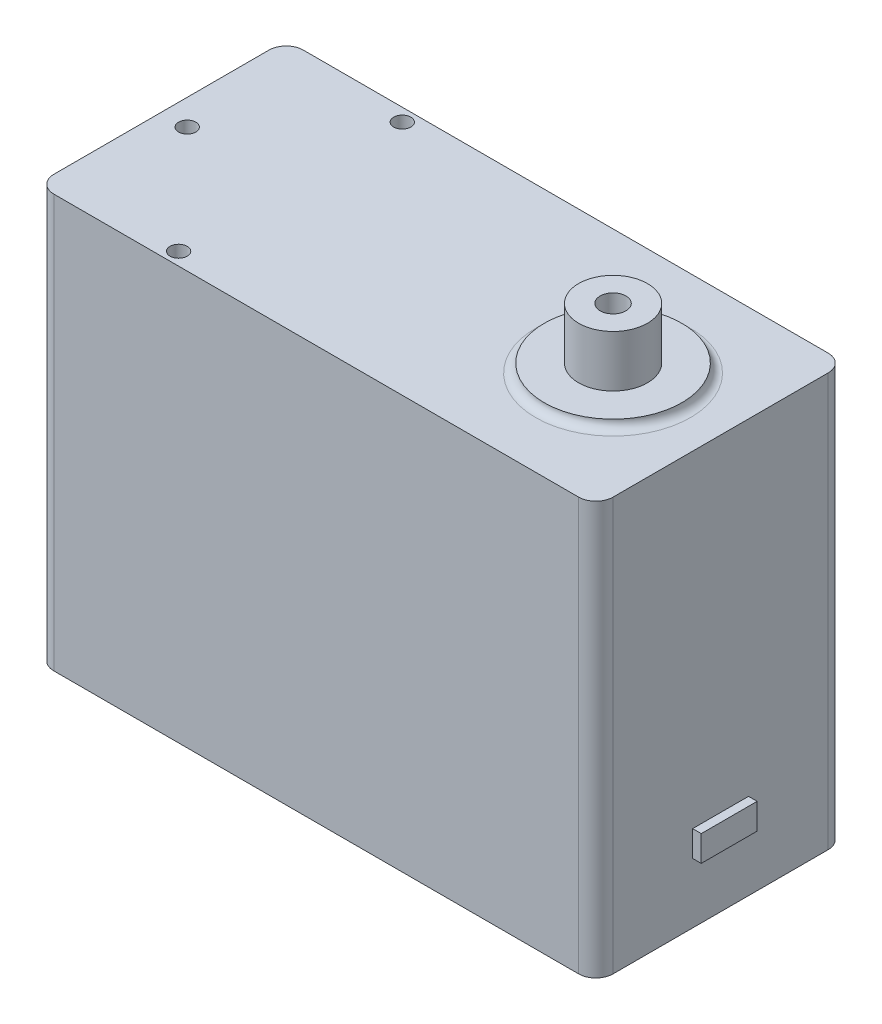
ISO-10303-21;
HEADER;
FILE_DESCRIPTION(('STEP AP214'),'2;1');
FILE_NAME('part.step','',(''),(''),'','','');
FILE_SCHEMA(('AUTOMOTIVE_DESIGN { 1 0 10303 214 1 1 1 1 }'));
ENDSEC;
DATA;
#1=APPLICATION_CONTEXT('core data for automotive mechanical design processes');
#2=APPLICATION_PROTOCOL_DEFINITION('international standard','automotive_design',2000,#1);
#3=PRODUCT_CONTEXT('',#1,'mechanical');
#4=PRODUCT('Part','Part','',(#3));
#5=PRODUCT_RELATED_PRODUCT_CATEGORY('part','',(#4));
#6=PRODUCT_DEFINITION_FORMATION('','',#4);
#7=PRODUCT_DEFINITION_CONTEXT('part definition',#1,'design');
#8=PRODUCT_DEFINITION('design','',#6,#7);
#9=PRODUCT_DEFINITION_SHAPE('','',#8);
#10=(LENGTH_UNIT() NAMED_UNIT(*) SI_UNIT(.MILLI.,.METRE.));
#11=(NAMED_UNIT(*) PLANE_ANGLE_UNIT() SI_UNIT($,.RADIAN.));
#12=(NAMED_UNIT(*) SI_UNIT($,.STERADIAN.) SOLID_ANGLE_UNIT());
#13=UNCERTAINTY_MEASURE_WITH_UNIT(LENGTH_MEASURE(1.E-05),#10,'distance_accuracy_value','');
#14=(GEOMETRIC_REPRESENTATION_CONTEXT(3) GLOBAL_UNCERTAINTY_ASSIGNED_CONTEXT((#13)) GLOBAL_UNIT_ASSIGNED_CONTEXT((#10,
#11,#12)) REPRESENTATION_CONTEXT('',''));
#15=CARTESIAN_POINT('',(0.,0.,0.));
#16=DIRECTION('',(0.,0.,1.));
#17=DIRECTION('',(1.,0.,0.));
#18=AXIS2_PLACEMENT_3D('',#15,#16,#17);
#19=CARTESIAN_POINT('',(32.5,24.,-14.5));
#20=DIRECTION('',(-1.,0.,0.));
#21=DIRECTION('',(0.,0.,1.));
#22=AXIS2_PLACEMENT_3D('',#19,#20,#21);
#23=PLANE('',#22);
#24=DIRECTION('',(0.,0.,-1.));
#25=VECTOR('',#24,1.);
#26=CARTESIAN_POINT('',(32.5,-24.,-14.5));
#27=LINE('',#26,#25);
#28=CARTESIAN_POINT('',(32.5,-24.,12.5));
#29=VERTEX_POINT('',#28);
#30=CARTESIAN_POINT('',(32.5,-24.,-12.5));
#31=VERTEX_POINT('',#30);
#32=EDGE_CURVE('E217',#29,#31,#27,.T.);
#33=ORIENTED_EDGE('',*,*,#32,.T.);
#34=DIRECTION('',(0.,-1.,0.));
#35=VECTOR('',#34,1.);
#36=CARTESIAN_POINT('',(32.5,24.,-12.5));
#37=LINE('',#36,#35);
#38=CARTESIAN_POINT('',(32.5,24.,-12.5));
#39=VERTEX_POINT('',#38);
#40=EDGE_CURVE('E271',#31,#39,#37,.F.);
#41=ORIENTED_EDGE('',*,*,#40,.T.);
#42=DIRECTION('',(0.,0.,-1.));
#43=VECTOR('',#42,1.);
#44=CARTESIAN_POINT('',(32.5,24.,-14.5));
#45=LINE('',#44,#43);
#46=CARTESIAN_POINT('',(32.5,24.,12.5));
#47=VERTEX_POINT('',#46);
#48=EDGE_CURVE('E232',#47,#39,#45,.T.);
#49=ORIENTED_EDGE('',*,*,#48,.F.);
#50=DIRECTION('',(0.,-1.,0.));
#51=VECTOR('',#50,1.);
#52=CARTESIAN_POINT('',(32.5,24.,12.5));
#53=LINE('',#52,#51);
#54=EDGE_CURVE('E268',#47,#29,#53,.T.);
#55=ORIENTED_EDGE('',*,*,#54,.T.);
#56=EDGE_LOOP('',(#33,#41,#49,#55));
#57=FACE_BOUND('',#56,.T.);
#58=DIRECTION('',(0.,1.,0.));
#59=VECTOR('',#58,1.);
#60=CARTESIAN_POINT('',(32.5,-14.,-3.25));
#61=LINE('',#60,#59);
#62=CARTESIAN_POINT('',(32.5,-17.,-3.25));
#63=VERTEX_POINT('',#62);
#64=CARTESIAN_POINT('',(32.5,-14.,-3.25));
#65=VERTEX_POINT('',#64);
#66=EDGE_CURVE('E144',#63,#65,#61,.T.);
#67=ORIENTED_EDGE('',*,*,#66,.F.);
#68=DIRECTION('',(0.,0.,-1.));
#69=VECTOR('',#68,1.);
#70=CARTESIAN_POINT('',(32.5,-17.,3.25));
#71=LINE('',#70,#69);
#72=CARTESIAN_POINT('',(32.5,-17.,3.25));
#73=VERTEX_POINT('',#72);
#74=EDGE_CURVE('E141',#73,#63,#71,.T.);
#75=ORIENTED_EDGE('',*,*,#74,.F.);
#76=DIRECTION('',(0.,-1.,0.));
#77=VECTOR('',#76,1.);
#78=CARTESIAN_POINT('',(32.5,-14.,3.25));
#79=LINE('',#78,#77);
#80=CARTESIAN_POINT('',(32.5,-14.,3.25));
#81=VERTEX_POINT('',#80);
#82=EDGE_CURVE('E55',#81,#73,#79,.T.);
#83=ORIENTED_EDGE('',*,*,#82,.F.);
#84=DIRECTION('',(0.,0.,1.));
#85=VECTOR('',#84,1.);
#86=CARTESIAN_POINT('',(32.5,-14.,3.25));
#87=LINE('',#86,#85);
#88=EDGE_CURVE('E50',#65,#81,#87,.T.);
#89=ORIENTED_EDGE('',*,*,#88,.F.);
#90=EDGE_LOOP('',(#67,#75,#83,#89));
#91=FACE_BOUND('',#90,.T.);
#92=ADVANCED_FACE('F34',(#57,#91),#23,.F.);
#93=CARTESIAN_POINT('',(-32.5,24.,-14.5));
#94=DIRECTION('',(0.,0.,1.));
#95=DIRECTION('',(1.,0.,0.));
#96=AXIS2_PLACEMENT_3D('',#93,#94,#95);
#97=PLANE('',#96);
#98=DIRECTION('',(-1.,0.,0.));
#99=VECTOR('',#98,1.);
#100=CARTESIAN_POINT('',(-32.5,24.,-14.5));
#101=LINE('',#100,#99);
#102=CARTESIAN_POINT('',(30.5,24.,-14.5));
#103=VERTEX_POINT('',#102);
#104=CARTESIAN_POINT('',(-30.5,24.,-14.5));
#105=VERTEX_POINT('',#104);
#106=EDGE_CURVE('E235',#103,#105,#101,.T.);
#107=ORIENTED_EDGE('',*,*,#106,.F.);
#108=DIRECTION('',(0.,-1.,0.));
#109=VECTOR('',#108,1.);
#110=CARTESIAN_POINT('',(30.5,24.,-14.5));
#111=LINE('',#110,#109);
#112=CARTESIAN_POINT('',(30.5,-24.,-14.5));
#113=VERTEX_POINT('',#112);
#114=EDGE_CURVE('E257',#103,#113,#111,.T.);
#115=ORIENTED_EDGE('',*,*,#114,.T.);
#116=DIRECTION('',(-1.,0.,0.));
#117=VECTOR('',#116,1.);
#118=CARTESIAN_POINT('',(-32.5,-24.,-14.5));
#119=LINE('',#118,#117);
#120=CARTESIAN_POINT('',(-30.5,-24.,-14.5));
#121=VERTEX_POINT('',#120);
#122=EDGE_CURVE('E248',#113,#121,#119,.T.);
#123=ORIENTED_EDGE('',*,*,#122,.T.);
#124=DIRECTION('',(0.,-1.,0.));
#125=VECTOR('',#124,1.);
#126=CARTESIAN_POINT('',(-30.5,24.,-14.5));
#127=LINE('',#126,#125);
#128=EDGE_CURVE('E245',#121,#105,#127,.F.);
#129=ORIENTED_EDGE('',*,*,#128,.T.);
#130=EDGE_LOOP('',(#107,#115,#123,#129));
#131=FACE_BOUND('',#130,.T.);
#132=ADVANCED_FACE('F317',(#131),#97,.F.);
#133=CARTESIAN_POINT('',(-32.5,24.,-14.5));
#134=DIRECTION('',(1.,0.,0.));
#135=DIRECTION('',(0.,0.,-1.));
#136=AXIS2_PLACEMENT_3D('',#133,#134,#135);
#137=PLANE('',#136);
#138=DIRECTION('',(0.,0.,1.));
#139=VECTOR('',#138,1.);
#140=CARTESIAN_POINT('',(-32.5,-24.,-14.5));
#141=LINE('',#140,#139);
#142=CARTESIAN_POINT('',(-32.5,-24.,-12.5));
#143=VERTEX_POINT('',#142);
#144=CARTESIAN_POINT('',(-32.5,-24.,12.5));
#145=VERTEX_POINT('',#144);
#146=EDGE_CURVE('E251',#143,#145,#141,.T.);
#147=ORIENTED_EDGE('',*,*,#146,.T.);
#148=DIRECTION('',(0.,-1.,0.));
#149=VECTOR('',#148,1.);
#150=CARTESIAN_POINT('',(-32.5,24.,12.5));
#151=LINE('',#150,#149);
#152=CARTESIAN_POINT('',(-32.5,24.,12.5));
#153=VERTEX_POINT('',#152);
#154=EDGE_CURVE('E289',#145,#153,#151,.F.);
#155=ORIENTED_EDGE('',*,*,#154,.T.);
#156=DIRECTION('',(0.,0.,1.));
#157=VECTOR('',#156,1.);
#158=CARTESIAN_POINT('',(-32.5,24.,-14.5));
#159=LINE('',#158,#157);
#160=CARTESIAN_POINT('',(-32.5,24.,-12.5));
#161=VERTEX_POINT('',#160);
#162=EDGE_CURVE('E239',#161,#153,#159,.T.);
#163=ORIENTED_EDGE('',*,*,#162,.F.);
#164=DIRECTION('',(0.,-1.,0.));
#165=VECTOR('',#164,1.);
#166=CARTESIAN_POINT('',(-32.5,24.,-12.5));
#167=LINE('',#166,#165);
#168=EDGE_CURVE('E286',#161,#143,#167,.T.);
#169=ORIENTED_EDGE('',*,*,#168,.T.);
#170=EDGE_LOOP('',(#147,#155,#163,#169));
#171=FACE_BOUND('',#170,.T.);
#172=ADVANCED_FACE('F323',(#171),#137,.F.);
#173=CARTESIAN_POINT('',(-32.5,24.,14.5));
#174=DIRECTION('',(0.,0.,-1.));
#175=DIRECTION('',(-1.,0.,0.));
#176=AXIS2_PLACEMENT_3D('',#173,#174,#175);
#177=PLANE('',#176);
#178=DIRECTION('',(1.,0.,0.));
#179=VECTOR('',#178,1.);
#180=CARTESIAN_POINT('',(-32.5,-24.,14.5));
#181=LINE('',#180,#179);
#182=CARTESIAN_POINT('',(-30.5,-24.,14.5));
#183=VERTEX_POINT('',#182);
#184=CARTESIAN_POINT('',(30.5,-24.,14.5));
#185=VERTEX_POINT('',#184);
#186=EDGE_CURVE('E236',#183,#185,#181,.T.);
#187=ORIENTED_EDGE('',*,*,#186,.T.);
#188=DIRECTION('',(0.,-1.,0.));
#189=VECTOR('',#188,1.);
#190=CARTESIAN_POINT('',(30.5,24.,14.5));
#191=LINE('',#190,#189);
#192=CARTESIAN_POINT('',(30.5,24.,14.5));
#193=VERTEX_POINT('',#192);
#194=EDGE_CURVE('E284',#185,#193,#191,.F.);
#195=ORIENTED_EDGE('',*,*,#194,.T.);
#196=DIRECTION('',(1.,0.,0.));
#197=VECTOR('',#196,1.);
#198=CARTESIAN_POINT('',(-32.5,24.,14.5));
#199=LINE('',#198,#197);
#200=CARTESIAN_POINT('',(-30.5,24.,14.5));
#201=VERTEX_POINT('',#200);
#202=EDGE_CURVE('E242',#201,#193,#199,.T.);
#203=ORIENTED_EDGE('',*,*,#202,.F.);
#204=DIRECTION('',(0.,-1.,0.));
#205=VECTOR('',#204,1.);
#206=CARTESIAN_POINT('',(-30.5,24.,14.5));
#207=LINE('',#206,#205);
#208=EDGE_CURVE('E281',#201,#183,#207,.T.);
#209=ORIENTED_EDGE('',*,*,#208,.T.);
#210=EDGE_LOOP('',(#187,#195,#203,#209));
#211=FACE_BOUND('',#210,.T.);
#212=ADVANCED_FACE('F365',(#211),#177,.F.);
#213=CARTESIAN_POINT('',(0.,24.,0.));
#214=DIRECTION('',(0.,1.,0.));
#215=DIRECTION('',(0.,0.,1.));
#216=AXIS2_PLACEMENT_3D('',#213,#214,#215);
#217=PLANE('',#216);
#218=CARTESIAN_POINT('',(20.,24.,0.));
#219=DIRECTION('',(0.,1.,0.));
#220=DIRECTION('',(0.,0.,1.));
#221=AXIS2_PLACEMENT_3D('',#218,#219,#220);
#222=CIRCLE('',#221,9.);
#223=CARTESIAN_POINT('',(20.,24.,9.));
#224=VERTEX_POINT('',#223);
#225=EDGE_CURVE('E43',#224,#224,#222,.F.);
#226=ORIENTED_EDGE('',*,*,#225,.T.);
#227=EDGE_LOOP('',(#226));
#228=FACE_BOUND('',#227,.T.);
#229=CARTESIAN_POINT('',(-29.5,24.,0.));
#230=DIRECTION('',(0.,1.,0.));
#231=DIRECTION('',(0.,0.,1.));
#232=AXIS2_PLACEMENT_3D('',#229,#230,#231);
#233=CIRCLE('',#232,1.);
#234=CARTESIAN_POINT('',(-29.5,24.,1.));
#235=VERTEX_POINT('',#234);
#236=EDGE_CURVE('E218',#235,#235,#233,.T.);
#237=ORIENTED_EDGE('',*,*,#236,.F.);
#238=EDGE_LOOP('',(#237));
#239=FACE_BOUND('',#238,.T.);
#240=CARTESIAN_POINT('',(-17.5,24.,13.));
#241=DIRECTION('',(0.,1.,0.));
#242=DIRECTION('',(0.,0.,1.));
#243=AXIS2_PLACEMENT_3D('',#240,#241,#242);
#244=CIRCLE('',#243,1.);
#245=CARTESIAN_POINT('',(-17.5,24.,14.));
#246=VERTEX_POINT('',#245);
#247=EDGE_CURVE('E224',#246,#246,#244,.T.);
#248=ORIENTED_EDGE('',*,*,#247,.F.);
#249=EDGE_LOOP('',(#248));
#250=FACE_BOUND('',#249,.T.);
#251=CARTESIAN_POINT('',(-17.5,24.,-13.));
#252=DIRECTION('',(0.,1.,0.));
#253=DIRECTION('',(0.,0.,-1.));
#254=AXIS2_PLACEMENT_3D('',#251,#252,#253);
#255=CIRCLE('',#254,1.);
#256=CARTESIAN_POINT('',(-17.5,24.,-14.));
#257=VERTEX_POINT('',#256);
#258=EDGE_CURVE('E213',#257,#257,#255,.T.);
#259=ORIENTED_EDGE('',*,*,#258,.F.);
#260=EDGE_LOOP('',(#259));
#261=FACE_BOUND('',#260,.T.);
#262=ORIENTED_EDGE('',*,*,#48,.T.);
#263=CARTESIAN_POINT('',(30.5,24.,-12.5));
#264=DIRECTION('',(0.,1.,0.));
#265=DIRECTION('',(0.,0.,1.));
#266=AXIS2_PLACEMENT_3D('',#263,#264,#265);
#267=CIRCLE('',#266,2.);
#268=EDGE_CURVE('E279',#39,#103,#267,.T.);
#269=ORIENTED_EDGE('',*,*,#268,.T.);
#270=ORIENTED_EDGE('',*,*,#106,.T.);
#271=CARTESIAN_POINT('',(-30.5,24.,-12.5));
#272=DIRECTION('',(0.,1.,0.));
#273=DIRECTION('',(0.,0.,1.));
#274=AXIS2_PLACEMENT_3D('',#271,#272,#273);
#275=CIRCLE('',#274,2.);
#276=EDGE_CURVE('E273',#105,#161,#275,.T.);
#277=ORIENTED_EDGE('',*,*,#276,.T.);
#278=ORIENTED_EDGE('',*,*,#162,.T.);
#279=CARTESIAN_POINT('',(-30.5,24.,12.5));
#280=DIRECTION('',(0.,1.,0.));
#281=DIRECTION('',(0.,0.,1.));
#282=AXIS2_PLACEMENT_3D('',#279,#280,#281);
#283=CIRCLE('',#282,2.);
#284=EDGE_CURVE('E275',#153,#201,#283,.T.);
#285=ORIENTED_EDGE('',*,*,#284,.T.);
#286=ORIENTED_EDGE('',*,*,#202,.T.);
#287=CARTESIAN_POINT('',(30.5,24.,12.5));
#288=DIRECTION('',(0.,1.,0.));
#289=DIRECTION('',(0.,0.,1.));
#290=AXIS2_PLACEMENT_3D('',#287,#288,#289);
#291=CIRCLE('',#290,2.);
#292=EDGE_CURVE('E277',#193,#47,#291,.T.);
#293=ORIENTED_EDGE('',*,*,#292,.T.);
#294=EDGE_LOOP('',(#262,#269,#270,#277,#278,#285,#286,#293));
#295=FACE_BOUND('',#294,.T.);
#296=ADVANCED_FACE('F294',(#228,#239,#250,#261,#295),#217,.T.);
#297=CARTESIAN_POINT('',(0.,-24.,0.));
#298=DIRECTION('',(0.,1.,0.));
#299=DIRECTION('',(0.,0.,1.));
#300=AXIS2_PLACEMENT_3D('',#297,#298,#299);
#301=PLANE('',#300);
#302=CARTESIAN_POINT('',(20.,-24.,0.));
#303=DIRECTION('',(0.,1.,0.));
#304=DIRECTION('',(0.,0.,1.));
#305=AXIS2_PLACEMENT_3D('',#302,#303,#304);
#306=CIRCLE('',#305,9.);
#307=CARTESIAN_POINT('',(20.,-24.,9.));
#308=VERTEX_POINT('',#307);
#309=EDGE_CURVE('E11',#308,#308,#306,.T.);
#310=ORIENTED_EDGE('',*,*,#309,.T.);
#311=EDGE_LOOP('',(#310));
#312=FACE_BOUND('',#311,.T.);
#313=CARTESIAN_POINT('',(-29.5,-24.,-13.));
#314=DIRECTION('',(0.,-1.,0.));
#315=DIRECTION('',(0.,0.,1.));
#316=AXIS2_PLACEMENT_3D('',#313,#314,#315);
#317=CIRCLE('',#316,1.);
#318=CARTESIAN_POINT('',(-29.5,-24.,-12.));
#319=VERTEX_POINT('',#318);
#320=EDGE_CURVE('E179',#319,#319,#317,.T.);
#321=ORIENTED_EDGE('',*,*,#320,.F.);
#322=EDGE_LOOP('',(#321));
#323=FACE_BOUND('',#322,.T.);
#324=CARTESIAN_POINT('',(29.5,-24.,-13.));
#325=DIRECTION('',(0.,-1.,0.));
#326=DIRECTION('',(0.,0.,-1.));
#327=AXIS2_PLACEMENT_3D('',#324,#325,#326);
#328=CIRCLE('',#327,1.);
#329=CARTESIAN_POINT('',(29.5,-24.,-14.));
#330=VERTEX_POINT('',#329);
#331=EDGE_CURVE('E185',#330,#330,#328,.T.);
#332=ORIENTED_EDGE('',*,*,#331,.F.);
#333=EDGE_LOOP('',(#332));
#334=FACE_BOUND('',#333,.T.);
#335=CARTESIAN_POINT('',(29.5,-24.,13.));
#336=DIRECTION('',(0.,-1.,0.));
#337=DIRECTION('',(0.,0.,1.));
#338=AXIS2_PLACEMENT_3D('',#335,#336,#337);
#339=CIRCLE('',#338,1.);
#340=CARTESIAN_POINT('',(29.5,-24.,14.));
#341=VERTEX_POINT('',#340);
#342=EDGE_CURVE('E191',#341,#341,#339,.T.);
#343=ORIENTED_EDGE('',*,*,#342,.F.);
#344=EDGE_LOOP('',(#343));
#345=FACE_BOUND('',#344,.T.);
#346=CARTESIAN_POINT('',(-5.50000000000002,-24.,13.));
#347=DIRECTION('',(0.,-1.,0.));
#348=DIRECTION('',(0.,0.,-1.));
#349=AXIS2_PLACEMENT_3D('',#346,#347,#348);
#350=CIRCLE('',#349,1.);
#351=CARTESIAN_POINT('',(-5.50000000000002,-24.,12.));
#352=VERTEX_POINT('',#351);
#353=EDGE_CURVE('E172',#352,#352,#350,.T.);
#354=ORIENTED_EDGE('',*,*,#353,.F.);
#355=EDGE_LOOP('',(#354));
#356=FACE_BOUND('',#355,.T.);
#357=CARTESIAN_POINT('',(-5.50000000000002,-24.,-13.));
#358=DIRECTION('',(0.,-1.,0.));
#359=DIRECTION('',(0.,0.,1.));
#360=AXIS2_PLACEMENT_3D('',#357,#358,#359);
#361=CIRCLE('',#360,1.);
#362=CARTESIAN_POINT('',(-5.50000000000002,-24.,-12.));
#363=VERTEX_POINT('',#362);
#364=EDGE_CURVE('E168',#363,#363,#361,.T.);
#365=ORIENTED_EDGE('',*,*,#364,.F.);
#366=EDGE_LOOP('',(#365));
#367=FACE_BOUND('',#366,.T.);
#368=CARTESIAN_POINT('',(-29.5,-24.,13.));
#369=DIRECTION('',(0.,-1.,0.));
#370=DIRECTION('',(0.,0.,-1.));
#371=AXIS2_PLACEMENT_3D('',#368,#369,#370);
#372=CIRCLE('',#371,1.);
#373=CARTESIAN_POINT('',(-29.5,-24.,12.));
#374=VERTEX_POINT('',#373);
#375=EDGE_CURVE('E178',#374,#374,#372,.T.);
#376=ORIENTED_EDGE('',*,*,#375,.F.);
#377=EDGE_LOOP('',(#376));
#378=FACE_BOUND('',#377,.T.);
#379=ORIENTED_EDGE('',*,*,#122,.F.);
#380=CARTESIAN_POINT('',(30.5,-24.,-12.5));
#381=DIRECTION('',(0.,1.,0.));
#382=DIRECTION('',(0.,0.,1.));
#383=AXIS2_PLACEMENT_3D('',#380,#381,#382);
#384=CIRCLE('',#383,2.);
#385=EDGE_CURVE('E266',#113,#31,#384,.F.);
#386=ORIENTED_EDGE('',*,*,#385,.T.);
#387=ORIENTED_EDGE('',*,*,#32,.F.);
#388=CARTESIAN_POINT('',(30.5,-24.,12.5));
#389=DIRECTION('',(0.,1.,0.));
#390=DIRECTION('',(0.,0.,1.));
#391=AXIS2_PLACEMENT_3D('',#388,#389,#390);
#392=CIRCLE('',#391,2.);
#393=EDGE_CURVE('E264',#29,#185,#392,.F.);
#394=ORIENTED_EDGE('',*,*,#393,.T.);
#395=ORIENTED_EDGE('',*,*,#186,.F.);
#396=CARTESIAN_POINT('',(-30.5,-24.,12.5));
#397=DIRECTION('',(0.,1.,0.));
#398=DIRECTION('',(0.,0.,1.));
#399=AXIS2_PLACEMENT_3D('',#396,#397,#398);
#400=CIRCLE('',#399,2.);
#401=EDGE_CURVE('E262',#183,#145,#400,.F.);
#402=ORIENTED_EDGE('',*,*,#401,.T.);
#403=ORIENTED_EDGE('',*,*,#146,.F.);
#404=CARTESIAN_POINT('',(-30.5,-24.,-12.5));
#405=DIRECTION('',(0.,1.,0.));
#406=DIRECTION('',(0.,0.,1.));
#407=AXIS2_PLACEMENT_3D('',#404,#405,#406);
#408=CIRCLE('',#407,2.);
#409=EDGE_CURVE('E260',#143,#121,#408,.F.);
#410=ORIENTED_EDGE('',*,*,#409,.T.);
#411=EDGE_LOOP('',(#379,#386,#387,#394,#395,#402,#403,#410));
#412=FACE_BOUND('',#411,.T.);
#413=ADVANCED_FACE('F332',(#312,#323,#334,#345,#356,#367,#378,#412),#301,.F.);
#414=CARTESIAN_POINT('',(30.5,24.,-12.5));
#415=DIRECTION('',(0.,-1.,0.));
#416=DIRECTION('',(0.,0.,-1.));
#417=AXIS2_PLACEMENT_3D('',#414,#415,#416);
#418=CYLINDRICAL_SURFACE('',#417,2.);
#419=ORIENTED_EDGE('',*,*,#268,.F.);
#420=ORIENTED_EDGE('',*,*,#40,.F.);
#421=ORIENTED_EDGE('',*,*,#385,.F.);
#422=ORIENTED_EDGE('',*,*,#114,.F.);
#423=EDGE_LOOP('',(#419,#420,#421,#422));
#424=FACE_BOUND('',#423,.T.);
#425=ADVANCED_FACE('F328',(#424),#418,.T.);
#426=CARTESIAN_POINT('',(30.5,24.,12.5));
#427=DIRECTION('',(0.,-1.,0.));
#428=DIRECTION('',(0.,0.,-1.));
#429=AXIS2_PLACEMENT_3D('',#426,#427,#428);
#430=CYLINDRICAL_SURFACE('',#429,2.);
#431=ORIENTED_EDGE('',*,*,#292,.F.);
#432=ORIENTED_EDGE('',*,*,#194,.F.);
#433=ORIENTED_EDGE('',*,*,#393,.F.);
#434=ORIENTED_EDGE('',*,*,#54,.F.);
#435=EDGE_LOOP('',(#431,#432,#433,#434));
#436=FACE_BOUND('',#435,.T.);
#437=ADVANCED_FACE('F331',(#436),#430,.T.);
#438=CARTESIAN_POINT('',(-30.5,24.,12.5));
#439=DIRECTION('',(0.,-1.,0.));
#440=DIRECTION('',(0.,0.,-1.));
#441=AXIS2_PLACEMENT_3D('',#438,#439,#440);
#442=CYLINDRICAL_SURFACE('',#441,2.);
#443=ORIENTED_EDGE('',*,*,#284,.F.);
#444=ORIENTED_EDGE('',*,*,#154,.F.);
#445=ORIENTED_EDGE('',*,*,#401,.F.);
#446=ORIENTED_EDGE('',*,*,#208,.F.);
#447=EDGE_LOOP('',(#443,#444,#445,#446));
#448=FACE_BOUND('',#447,.T.);
#449=ADVANCED_FACE('F336',(#448),#442,.T.);
#450=CARTESIAN_POINT('',(-30.5,24.,-12.5));
#451=DIRECTION('',(0.,-1.,0.));
#452=DIRECTION('',(0.,0.,-1.));
#453=AXIS2_PLACEMENT_3D('',#450,#451,#452);
#454=CYLINDRICAL_SURFACE('',#453,2.);
#455=ORIENTED_EDGE('',*,*,#276,.F.);
#456=ORIENTED_EDGE('',*,*,#128,.F.);
#457=ORIENTED_EDGE('',*,*,#409,.F.);
#458=ORIENTED_EDGE('',*,*,#168,.F.);
#459=EDGE_LOOP('',(#455,#456,#457,#458));
#460=FACE_BOUND('',#459,.T.);
#461=ADVANCED_FACE('F340',(#460),#454,.T.);
#462=CARTESIAN_POINT('',(-17.5,18.,-13.));
#463=DIRECTION('',(0.,1.,0.));
#464=DIRECTION('',(0.,0.,1.));
#465=AXIS2_PLACEMENT_3D('',#462,#463,#464);
#466=CYLINDRICAL_SURFACE('',#465,1.);
#467=CARTESIAN_POINT('',(-17.5,18.,-13.));
#468=DIRECTION('',(0.,1.,0.));
#469=DIRECTION('',(0.,0.,-1.));
#470=AXIS2_PLACEMENT_3D('',#467,#468,#469);
#471=CIRCLE('',#470,1.);
#472=CARTESIAN_POINT('',(-17.5,18.,-14.));
#473=VERTEX_POINT('',#472);
#474=EDGE_CURVE('E227',#473,#473,#471,.T.);
#475=ORIENTED_EDGE('',*,*,#474,.F.);
#476=EDGE_LOOP('',(#475));
#477=FACE_BOUND('',#476,.T.);
#478=ORIENTED_EDGE('',*,*,#258,.T.);
#479=EDGE_LOOP('',(#478));
#480=FACE_BOUND('',#479,.T.);
#481=ADVANCED_FACE('F343',(#477,#480),#466,.F.);
#482=CARTESIAN_POINT('',(-17.5,18.,-13.));
#483=DIRECTION('',(0.,-1.,0.));
#484=DIRECTION('',(0.,0.,-1.));
#485=AXIS2_PLACEMENT_3D('',#482,#483,#484);
#486=PLANE('',#485);
#487=ORIENTED_EDGE('',*,*,#474,.T.);
#488=EDGE_LOOP('',(#487));
#489=FACE_BOUND('',#488,.T.);
#490=ADVANCED_FACE('F348',(#489),#486,.F.);
#491=CARTESIAN_POINT('',(-17.5,18.,13.));
#492=DIRECTION('',(0.,1.,0.));
#493=DIRECTION('',(0.,0.,1.));
#494=AXIS2_PLACEMENT_3D('',#491,#492,#493);
#495=CYLINDRICAL_SURFACE('',#494,1.);
#496=CARTESIAN_POINT('',(-17.5,18.,13.));
#497=DIRECTION('',(0.,1.,0.));
#498=DIRECTION('',(0.,0.,1.));
#499=AXIS2_PLACEMENT_3D('',#496,#497,#498);
#500=CIRCLE('',#499,1.);
#501=CARTESIAN_POINT('',(-17.5,18.,14.));
#502=VERTEX_POINT('',#501);
#503=EDGE_CURVE('E221',#502,#502,#500,.T.);
#504=ORIENTED_EDGE('',*,*,#503,.F.);
#505=EDGE_LOOP('',(#504));
#506=FACE_BOUND('',#505,.T.);
#507=ORIENTED_EDGE('',*,*,#247,.T.);
#508=EDGE_LOOP('',(#507));
#509=FACE_BOUND('',#508,.T.);
#510=ADVANCED_FACE('F774',(#506,#509),#495,.F.);
#511=CARTESIAN_POINT('',(-17.5,18.,13.));
#512=DIRECTION('',(0.,1.,0.));
#513=DIRECTION('',(0.,0.,1.));
#514=AXIS2_PLACEMENT_3D('',#511,#512,#513);
#515=PLANE('',#514);
#516=ORIENTED_EDGE('',*,*,#503,.T.);
#517=EDGE_LOOP('',(#516));
#518=FACE_BOUND('',#517,.T.);
#519=ADVANCED_FACE('F783',(#518),#515,.T.);
#520=CARTESIAN_POINT('',(-29.5,18.,0.));
#521=DIRECTION('',(0.,1.,0.));
#522=DIRECTION('',(0.,0.,1.));
#523=AXIS2_PLACEMENT_3D('',#520,#521,#522);
#524=CYLINDRICAL_SURFACE('',#523,1.);
#525=CARTESIAN_POINT('',(-29.5,18.,0.));
#526=DIRECTION('',(0.,1.,0.));
#527=DIRECTION('',(0.,0.,1.));
#528=AXIS2_PLACEMENT_3D('',#525,#526,#527);
#529=CIRCLE('',#528,1.);
#530=CARTESIAN_POINT('',(-29.5,18.,1.));
#531=VERTEX_POINT('',#530);
#532=EDGE_CURVE('E214',#531,#531,#529,.T.);
#533=ORIENTED_EDGE('',*,*,#532,.F.);
#534=EDGE_LOOP('',(#533));
#535=FACE_BOUND('',#534,.T.);
#536=ORIENTED_EDGE('',*,*,#236,.T.);
#537=EDGE_LOOP('',(#536));
#538=FACE_BOUND('',#537,.T.);
#539=ADVANCED_FACE('F311',(#535,#538),#524,.F.);
#540=CARTESIAN_POINT('',(-29.5,18.,0.));
#541=DIRECTION('',(0.,1.,0.));
#542=DIRECTION('',(0.,0.,1.));
#543=AXIS2_PLACEMENT_3D('',#540,#541,#542);
#544=PLANE('',#543);
#545=ORIENTED_EDGE('',*,*,#532,.T.);
#546=EDGE_LOOP('',(#545));
#547=FACE_BOUND('',#546,.T.);
#548=ADVANCED_FACE('F305',(#547),#544,.T.);
#549=CARTESIAN_POINT('',(20.,25.,0.));
#550=DIRECTION('',(0.,1.,0.));
#551=DIRECTION('',(0.,0.,1.));
#552=AXIS2_PLACEMENT_3D('',#549,#550,#551);
#553=PLANE('',#552);
#554=CARTESIAN_POINT('',(20.,25.,0.));
#555=DIRECTION('',(0.,1.,0.));
#556=DIRECTION('',(0.,0.,1.));
#557=AXIS2_PLACEMENT_3D('',#554,#555,#556);
#558=CIRCLE('',#557,4.);
#559=CARTESIAN_POINT('',(20.,25.,4.));
#560=VERTEX_POINT('',#559);
#561=EDGE_CURVE('E202',#560,#560,#558,.T.);
#562=ORIENTED_EDGE('',*,*,#561,.F.);
#563=EDGE_LOOP('',(#562));
#564=FACE_BOUND('',#563,.T.);
#565=CARTESIAN_POINT('',(20.,25.,0.));
#566=DIRECTION('',(0.,1.,0.));
#567=DIRECTION('',(0.,0.,1.));
#568=AXIS2_PLACEMENT_3D('',#565,#566,#567);
#569=CIRCLE('',#568,8.);
#570=CARTESIAN_POINT('',(20.,25.,8.));
#571=VERTEX_POINT('',#570);
#572=EDGE_CURVE('E208',#571,#571,#569,.T.);
#573=ORIENTED_EDGE('',*,*,#572,.T.);
#574=EDGE_LOOP('',(#573));
#575=FACE_BOUND('',#574,.T.);
#576=ADVANCED_FACE('F301',(#564,#575),#553,.T.);
#577=CARTESIAN_POINT('',(20.,25.,0.));
#578=DIRECTION('',(0.,1.,0.));
#579=DIRECTION('',(0.,0.,1.));
#580=AXIS2_PLACEMENT_3D('',#577,#578,#579);
#581=TOROIDAL_SURFACE('',#580,9.,1.);
#582=ORIENTED_EDGE('',*,*,#225,.F.);
#583=EDGE_LOOP('',(#582));
#584=FACE_BOUND('',#583,.T.);
#585=ORIENTED_EDGE('',*,*,#572,.F.);
#586=EDGE_LOOP('',(#585));
#587=FACE_BOUND('',#586,.T.);
#588=ADVANCED_FACE('F297',(#584,#587),#581,.F.);
#589=CARTESIAN_POINT('',(20.,31.,0.));
#590=DIRECTION('',(0.,-1.,0.));
#591=DIRECTION('',(0.,0.,-1.));
#592=AXIS2_PLACEMENT_3D('',#589,#590,#591);
#593=CYLINDRICAL_SURFACE('',#592,4.);
#594=CARTESIAN_POINT('',(20.,31.,0.));
#595=DIRECTION('',(0.,1.,0.));
#596=DIRECTION('',(0.,0.,1.));
#597=AXIS2_PLACEMENT_3D('',#594,#595,#596);
#598=CIRCLE('',#597,4.);
#599=CARTESIAN_POINT('',(20.,31.,4.));
#600=VERTEX_POINT('',#599);
#601=EDGE_CURVE('E205',#600,#600,#598,.T.);
#602=ORIENTED_EDGE('',*,*,#601,.F.);
#603=EDGE_LOOP('',(#602));
#604=FACE_BOUND('',#603,.T.);
#605=ORIENTED_EDGE('',*,*,#561,.T.);
#606=EDGE_LOOP('',(#605));
#607=FACE_BOUND('',#606,.T.);
#608=ADVANCED_FACE('F300',(#604,#607),#593,.T.);
#609=CARTESIAN_POINT('',(20.,31.,0.));
#610=DIRECTION('',(0.,1.,0.));
#611=DIRECTION('',(0.,0.,1.));
#612=AXIS2_PLACEMENT_3D('',#609,#610,#611);
#613=PLANE('',#612);
#614=CARTESIAN_POINT('',(20.,31.,0.));
#615=DIRECTION('',(0.,1.,0.));
#616=DIRECTION('',(0.,0.,1.));
#617=AXIS2_PLACEMENT_3D('',#614,#615,#616);
#618=CIRCLE('',#617,1.5);
#619=CARTESIAN_POINT('',(20.,31.,1.5));
#620=VERTEX_POINT('',#619);
#621=EDGE_CURVE('E710',#620,#620,#618,.T.);
#622=ORIENTED_EDGE('',*,*,#621,.F.);
#623=EDGE_LOOP('',(#622));
#624=FACE_BOUND('',#623,.T.);
#625=ORIENTED_EDGE('',*,*,#601,.T.);
#626=EDGE_LOOP('',(#625));
#627=FACE_BOUND('',#626,.T.);
#628=ADVANCED_FACE('F424',(#624,#627),#613,.T.);
#629=CARTESIAN_POINT('',(-29.5,-18.,13.));
#630=DIRECTION('',(0.,-1.,0.));
#631=DIRECTION('',(0.,0.,-1.));
#632=AXIS2_PLACEMENT_3D('',#629,#630,#631);
#633=CYLINDRICAL_SURFACE('',#632,1.);
#634=CARTESIAN_POINT('',(-29.5,-18.,13.));
#635=DIRECTION('',(0.,-1.,0.));
#636=DIRECTION('',(0.,0.,-1.));
#637=AXIS2_PLACEMENT_3D('',#634,#635,#636);
#638=CIRCLE('',#637,1.);
#639=CARTESIAN_POINT('',(-29.5,-18.,12.));
#640=VERTEX_POINT('',#639);
#641=EDGE_CURVE('E199',#640,#640,#638,.T.);
#642=ORIENTED_EDGE('',*,*,#641,.F.);
#643=EDGE_LOOP('',(#642));
#644=FACE_BOUND('',#643,.T.);
#645=ORIENTED_EDGE('',*,*,#375,.T.);
#646=EDGE_LOOP('',(#645));
#647=FACE_BOUND('',#646,.T.);
#648=ADVANCED_FACE('F431',(#644,#647),#633,.F.);
#649=CARTESIAN_POINT('',(-29.5,-18.,13.));
#650=DIRECTION('',(0.,-1.,0.));
#651=DIRECTION('',(0.,0.,-1.));
#652=AXIS2_PLACEMENT_3D('',#649,#650,#651);
#653=PLANE('',#652);
#654=ORIENTED_EDGE('',*,*,#641,.T.);
#655=EDGE_LOOP('',(#654));
#656=FACE_BOUND('',#655,.T.);
#657=ADVANCED_FACE('F436',(#656),#653,.T.);
#658=CARTESIAN_POINT('',(-5.50000000000002,-18.,-13.));
#659=DIRECTION('',(0.,-1.,0.));
#660=DIRECTION('',(0.,0.,-1.));
#661=AXIS2_PLACEMENT_3D('',#658,#659,#660);
#662=CYLINDRICAL_SURFACE('',#661,1.);
#663=CARTESIAN_POINT('',(-5.50000000000002,-18.,-13.));
#664=DIRECTION('',(0.,-1.,0.));
#665=DIRECTION('',(0.,0.,1.));
#666=AXIS2_PLACEMENT_3D('',#663,#664,#665);
#667=CIRCLE('',#666,1.);
#668=CARTESIAN_POINT('',(-5.50000000000002,-18.,-12.));
#669=VERTEX_POINT('',#668);
#670=EDGE_CURVE('E169',#669,#669,#667,.T.);
#671=ORIENTED_EDGE('',*,*,#670,.F.);
#672=EDGE_LOOP('',(#671));
#673=FACE_BOUND('',#672,.T.);
#674=ORIENTED_EDGE('',*,*,#364,.T.);
#675=EDGE_LOOP('',(#674));
#676=FACE_BOUND('',#675,.T.);
#677=ADVANCED_FACE('F446',(#673,#676),#662,.F.);
#678=CARTESIAN_POINT('',(-5.50000000000002,-18.,-13.));
#679=DIRECTION('',(0.,1.,0.));
#680=DIRECTION('',(0.,0.,1.));
#681=AXIS2_PLACEMENT_3D('',#678,#679,#680);
#682=PLANE('',#681);
#683=ORIENTED_EDGE('',*,*,#670,.T.);
#684=EDGE_LOOP('',(#683));
#685=FACE_BOUND('',#684,.T.);
#686=ADVANCED_FACE('F456',(#685),#682,.F.);
#687=CARTESIAN_POINT('',(-5.50000000000002,-18.,13.));
#688=DIRECTION('',(0.,-1.,0.));
#689=DIRECTION('',(0.,0.,-1.));
#690=AXIS2_PLACEMENT_3D('',#687,#688,#689);
#691=CYLINDRICAL_SURFACE('',#690,1.);
#692=CARTESIAN_POINT('',(-5.50000000000002,-18.,13.));
#693=DIRECTION('',(0.,-1.,0.));
#694=DIRECTION('',(0.,0.,-1.));
#695=AXIS2_PLACEMENT_3D('',#692,#693,#694);
#696=CIRCLE('',#695,1.);
#697=CARTESIAN_POINT('',(-5.50000000000002,-18.,12.));
#698=VERTEX_POINT('',#697);
#699=EDGE_CURVE('E194',#698,#698,#696,.T.);
#700=ORIENTED_EDGE('',*,*,#699,.F.);
#701=EDGE_LOOP('',(#700));
#702=FACE_BOUND('',#701,.T.);
#703=ORIENTED_EDGE('',*,*,#353,.T.);
#704=EDGE_LOOP('',(#703));
#705=FACE_BOUND('',#704,.T.);
#706=ADVANCED_FACE('F466',(#702,#705),#691,.F.);
#707=CARTESIAN_POINT('',(-5.50000000000002,-18.,13.));
#708=DIRECTION('',(0.,-1.,0.));
#709=DIRECTION('',(0.,0.,-1.));
#710=AXIS2_PLACEMENT_3D('',#707,#708,#709);
#711=PLANE('',#710);
#712=ORIENTED_EDGE('',*,*,#699,.T.);
#713=EDGE_LOOP('',(#712));
#714=FACE_BOUND('',#713,.T.);
#715=ADVANCED_FACE('F476',(#714),#711,.T.);
#716=CARTESIAN_POINT('',(29.5,-18.,13.));
#717=DIRECTION('',(0.,-1.,0.));
#718=DIRECTION('',(0.,0.,-1.));
#719=AXIS2_PLACEMENT_3D('',#716,#717,#718);
#720=CYLINDRICAL_SURFACE('',#719,1.);
#721=CARTESIAN_POINT('',(29.5,-18.,13.));
#722=DIRECTION('',(0.,-1.,0.));
#723=DIRECTION('',(0.,0.,1.));
#724=AXIS2_PLACEMENT_3D('',#721,#722,#723);
#725=CIRCLE('',#724,1.);
#726=CARTESIAN_POINT('',(29.5,-18.,14.));
#727=VERTEX_POINT('',#726);
#728=EDGE_CURVE('E188',#727,#727,#725,.T.);
#729=ORIENTED_EDGE('',*,*,#728,.F.);
#730=EDGE_LOOP('',(#729));
#731=FACE_BOUND('',#730,.T.);
#732=ORIENTED_EDGE('',*,*,#342,.T.);
#733=EDGE_LOOP('',(#732));
#734=FACE_BOUND('',#733,.T.);
#735=ADVANCED_FACE('F486',(#731,#734),#720,.F.);
#736=CARTESIAN_POINT('',(29.5,-18.,13.));
#737=DIRECTION('',(0.,1.,0.));
#738=DIRECTION('',(0.,0.,1.));
#739=AXIS2_PLACEMENT_3D('',#736,#737,#738);
#740=PLANE('',#739);
#741=ORIENTED_EDGE('',*,*,#728,.T.);
#742=EDGE_LOOP('',(#741));
#743=FACE_BOUND('',#742,.T.);
#744=ADVANCED_FACE('F496',(#743),#740,.F.);
#745=CARTESIAN_POINT('',(29.5,-18.,-13.));
#746=DIRECTION('',(0.,-1.,0.));
#747=DIRECTION('',(0.,0.,-1.));
#748=AXIS2_PLACEMENT_3D('',#745,#746,#747);
#749=CYLINDRICAL_SURFACE('',#748,1.);
#750=CARTESIAN_POINT('',(29.5,-18.,-13.));
#751=DIRECTION('',(0.,-1.,0.));
#752=DIRECTION('',(0.,0.,-1.));
#753=AXIS2_PLACEMENT_3D('',#750,#751,#752);
#754=CIRCLE('',#753,1.);
#755=CARTESIAN_POINT('',(29.5,-18.,-14.));
#756=VERTEX_POINT('',#755);
#757=EDGE_CURVE('E182',#756,#756,#754,.T.);
#758=ORIENTED_EDGE('',*,*,#757,.F.);
#759=EDGE_LOOP('',(#758));
#760=FACE_BOUND('',#759,.T.);
#761=ORIENTED_EDGE('',*,*,#331,.T.);
#762=EDGE_LOOP('',(#761));
#763=FACE_BOUND('',#762,.T.);
#764=ADVANCED_FACE('F506',(#760,#763),#749,.F.);
#765=CARTESIAN_POINT('',(29.5,-18.,-13.));
#766=DIRECTION('',(0.,-1.,0.));
#767=DIRECTION('',(0.,0.,-1.));
#768=AXIS2_PLACEMENT_3D('',#765,#766,#767);
#769=PLANE('',#768);
#770=ORIENTED_EDGE('',*,*,#757,.T.);
#771=EDGE_LOOP('',(#770));
#772=FACE_BOUND('',#771,.T.);
#773=ADVANCED_FACE('F516',(#772),#769,.T.);
#774=CARTESIAN_POINT('',(-29.5,-18.,-13.));
#775=DIRECTION('',(0.,-1.,0.));
#776=DIRECTION('',(0.,0.,-1.));
#777=AXIS2_PLACEMENT_3D('',#774,#775,#776);
#778=CYLINDRICAL_SURFACE('',#777,1.);
#779=CARTESIAN_POINT('',(-29.5,-18.,-13.));
#780=DIRECTION('',(0.,-1.,0.));
#781=DIRECTION('',(0.,0.,1.));
#782=AXIS2_PLACEMENT_3D('',#779,#780,#781);
#783=CIRCLE('',#782,1.);
#784=CARTESIAN_POINT('',(-29.5,-18.,-12.));
#785=VERTEX_POINT('',#784);
#786=EDGE_CURVE('E175',#785,#785,#783,.T.);
#787=ORIENTED_EDGE('',*,*,#786,.F.);
#788=EDGE_LOOP('',(#787));
#789=FACE_BOUND('',#788,.T.);
#790=ORIENTED_EDGE('',*,*,#320,.T.);
#791=EDGE_LOOP('',(#790));
#792=FACE_BOUND('',#791,.T.);
#793=ADVANCED_FACE('F526',(#789,#792),#778,.F.);
#794=CARTESIAN_POINT('',(-29.5,-18.,-13.));
#795=DIRECTION('',(0.,1.,0.));
#796=DIRECTION('',(0.,0.,1.));
#797=AXIS2_PLACEMENT_3D('',#794,#795,#796);
#798=PLANE('',#797);
#799=ORIENTED_EDGE('',*,*,#786,.T.);
#800=EDGE_LOOP('',(#799));
#801=FACE_BOUND('',#800,.T.);
#802=ADVANCED_FACE('F536',(#801),#798,.F.);
#803=CARTESIAN_POINT('',(20.,-25.,0.));
#804=DIRECTION('',(0.,-1.,0.));
#805=DIRECTION('',(0.,0.,-1.));
#806=AXIS2_PLACEMENT_3D('',#803,#804,#805);
#807=PLANE('',#806);
#808=CARTESIAN_POINT('',(20.,-25.,0.));
#809=DIRECTION('',(0.,-1.,0.));
#810=DIRECTION('',(0.,0.,-1.));
#811=AXIS2_PLACEMENT_3D('',#808,#809,#810);
#812=CIRCLE('',#811,3.5);
#813=CARTESIAN_POINT('',(20.,-25.,-3.5));
#814=VERTEX_POINT('',#813);
#815=EDGE_CURVE('E163',#814,#814,#812,.T.);
#816=ORIENTED_EDGE('',*,*,#815,.F.);
#817=EDGE_LOOP('',(#816));
#818=FACE_BOUND('',#817,.T.);
#819=CARTESIAN_POINT('',(20.,-25.,0.));
#820=DIRECTION('',(0.,-1.,0.));
#821=DIRECTION('',(0.,0.,-1.));
#822=AXIS2_PLACEMENT_3D('',#819,#820,#821);
#823=CIRCLE('',#822,8.);
#824=CARTESIAN_POINT('',(20.,-25.,-8.));
#825=VERTEX_POINT('',#824);
#826=EDGE_CURVE('E162',#825,#825,#823,.T.);
#827=ORIENTED_EDGE('',*,*,#826,.T.);
#828=EDGE_LOOP('',(#827));
#829=FACE_BOUND('',#828,.T.);
#830=ADVANCED_FACE('F545',(#818,#829),#807,.T.);
#831=CARTESIAN_POINT('',(20.,-25.,0.));
#832=DIRECTION('',(0.,1.,0.));
#833=DIRECTION('',(0.,0.,1.));
#834=AXIS2_PLACEMENT_3D('',#831,#832,#833);
#835=TOROIDAL_SURFACE('',#834,9.,1.);
#836=ORIENTED_EDGE('',*,*,#309,.F.);
#837=EDGE_LOOP('',(#836));
#838=FACE_BOUND('',#837,.T.);
#839=ORIENTED_EDGE('',*,*,#826,.F.);
#840=EDGE_LOOP('',(#839));
#841=FACE_BOUND('',#840,.T.);
#842=ADVANCED_FACE('F36',(#838,#841),#835,.F.);
#843=CARTESIAN_POINT('',(20.,-25.3,0.));
#844=DIRECTION('',(0.,1.,0.));
#845=DIRECTION('',(0.,0.,1.));
#846=AXIS2_PLACEMENT_3D('',#843,#844,#845);
#847=CYLINDRICAL_SURFACE('',#846,3.5);
#848=CARTESIAN_POINT('',(20.,-25.3,0.));
#849=DIRECTION('',(0.,-1.,0.));
#850=DIRECTION('',(0.,0.,-1.));
#851=AXIS2_PLACEMENT_3D('',#848,#849,#850);
#852=CIRCLE('',#851,3.5);
#853=CARTESIAN_POINT('',(20.,-25.3,-3.5));
#854=VERTEX_POINT('',#853);
#855=EDGE_CURVE('E159',#854,#854,#852,.T.);
#856=ORIENTED_EDGE('',*,*,#855,.F.);
#857=EDGE_LOOP('',(#856));
#858=FACE_BOUND('',#857,.T.);
#859=ORIENTED_EDGE('',*,*,#815,.T.);
#860=EDGE_LOOP('',(#859));
#861=FACE_BOUND('',#860,.T.);
#862=ADVANCED_FACE('F562',(#858,#861),#847,.T.);
#863=CARTESIAN_POINT('',(20.,-25.3,0.));
#864=DIRECTION('',(0.,-1.,0.));
#865=DIRECTION('',(0.,0.,-1.));
#866=AXIS2_PLACEMENT_3D('',#863,#864,#865);
#867=PLANE('',#866);
#868=CARTESIAN_POINT('',(20.,-25.3,0.));
#869=DIRECTION('',(0.,-1.,0.));
#870=DIRECTION('',(0.,0.,-1.));
#871=AXIS2_PLACEMENT_3D('',#868,#869,#870);
#872=CIRCLE('',#871,3.);
#873=CARTESIAN_POINT('',(20.,-25.3,-3.));
#874=VERTEX_POINT('',#873);
#875=EDGE_CURVE('E38',#874,#874,#872,.F.);
#876=ORIENTED_EDGE('',*,*,#875,.T.);
#877=EDGE_LOOP('',(#876));
#878=FACE_BOUND('',#877,.T.);
#879=ORIENTED_EDGE('',*,*,#855,.T.);
#880=EDGE_LOOP('',(#879));
#881=FACE_BOUND('',#880,.T.);
#882=ADVANCED_FACE('F578',(#878,#881),#867,.T.);
#883=CARTESIAN_POINT('',(20.,-30.5,0.));
#884=DIRECTION('',(0.,1.,0.));
#885=DIRECTION('',(0.,0.,1.));
#886=AXIS2_PLACEMENT_3D('',#883,#884,#885);
#887=CYLINDRICAL_SURFACE('',#886,3.);
#888=ORIENTED_EDGE('',*,*,#875,.F.);
#889=EDGE_LOOP('',(#888));
#890=FACE_BOUND('',#889,.T.);
#891=CARTESIAN_POINT('',(20.,-30.5,0.));
#892=DIRECTION('',(0.,-1.,0.));
#893=DIRECTION('',(0.,0.,-1.));
#894=AXIS2_PLACEMENT_3D('',#891,#892,#893);
#895=CIRCLE('',#894,3.);
#896=CARTESIAN_POINT('',(20.,-30.5,-3.));
#897=VERTEX_POINT('',#896);
#898=EDGE_CURVE('E155',#897,#897,#895,.T.);
#899=ORIENTED_EDGE('',*,*,#898,.F.);
#900=EDGE_LOOP('',(#899));
#901=FACE_BOUND('',#900,.T.);
#902=ADVANCED_FACE('F588',(#890,#901),#887,.T.);
#903=CARTESIAN_POINT('',(20.,-30.5,0.));
#904=DIRECTION('',(0.,-1.,0.));
#905=DIRECTION('',(0.,0.,-1.));
#906=AXIS2_PLACEMENT_3D('',#903,#904,#905);
#907=PLANE('',#906);
#908=CARTESIAN_POINT('',(20.,-30.5,0.));
#909=DIRECTION('',(0.,-1.,0.));
#910=DIRECTION('',(0.,0.,-1.));
#911=AXIS2_PLACEMENT_3D('',#908,#909,#910);
#912=CIRCLE('',#911,1.);
#913=CARTESIAN_POINT('',(20.,-30.5,-1.));
#914=VERTEX_POINT('',#913);
#915=EDGE_CURVE('E145',#914,#914,#912,.T.);
#916=ORIENTED_EDGE('',*,*,#915,.F.);
#917=EDGE_LOOP('',(#916));
#918=FACE_BOUND('',#917,.T.);
#919=ORIENTED_EDGE('',*,*,#898,.T.);
#920=EDGE_LOOP('',(#919));
#921=FACE_BOUND('',#920,.T.);
#922=ADVANCED_FACE('F598',(#918,#921),#907,.T.);
#923=CARTESIAN_POINT('',(20.,-25.,0.));
#924=DIRECTION('',(0.,-1.,0.));
#925=DIRECTION('',(0.,0.,-1.));
#926=AXIS2_PLACEMENT_3D('',#923,#924,#925);
#927=CYLINDRICAL_SURFACE('',#926,1.);
#928=CARTESIAN_POINT('',(20.,-25.,0.));
#929=DIRECTION('',(0.,-1.,0.));
#930=DIRECTION('',(0.,0.,-1.));
#931=AXIS2_PLACEMENT_3D('',#928,#929,#930);
#932=CIRCLE('',#931,1.);
#933=CARTESIAN_POINT('',(20.,-25.,-1.));
#934=VERTEX_POINT('',#933);
#935=EDGE_CURVE('E148',#934,#934,#932,.T.);
#936=ORIENTED_EDGE('',*,*,#935,.F.);
#937=EDGE_LOOP('',(#936));
#938=FACE_BOUND('',#937,.T.);
#939=ORIENTED_EDGE('',*,*,#915,.T.);
#940=EDGE_LOOP('',(#939));
#941=FACE_BOUND('',#940,.T.);
#942=ADVANCED_FACE('F608',(#938,#941),#927,.F.);
#943=CARTESIAN_POINT('',(20.,-25.,0.));
#944=DIRECTION('',(0.,-1.,0.));
#945=DIRECTION('',(0.,0.,-1.));
#946=AXIS2_PLACEMENT_3D('',#943,#944,#945);
#947=PLANE('',#946);
#948=ORIENTED_EDGE('',*,*,#935,.T.);
#949=EDGE_LOOP('',(#948));
#950=FACE_BOUND('',#949,.T.);
#951=ADVANCED_FACE('F618',(#950),#947,.T.);
#952=CARTESIAN_POINT('',(33.5,-14.,-3.25));
#953=DIRECTION('',(0.,0.,1.));
#954=DIRECTION('',(0.,-1.,0.));
#955=AXIS2_PLACEMENT_3D('',#952,#953,#954);
#956=PLANE('',#955);
#957=ORIENTED_EDGE('',*,*,#66,.T.);
#958=DIRECTION('',(-1.,0.,0.));
#959=VECTOR('',#958,1.);
#960=CARTESIAN_POINT('',(33.5,-14.,-3.25));
#961=LINE('',#960,#959);
#962=CARTESIAN_POINT('',(33.5,-14.,-3.25));
#963=VERTEX_POINT('',#962);
#964=EDGE_CURVE('E125',#963,#65,#961,.T.);
#965=ORIENTED_EDGE('',*,*,#964,.F.);
#966=DIRECTION('',(0.,1.,0.));
#967=VECTOR('',#966,1.);
#968=CARTESIAN_POINT('',(33.5,-14.,-3.25));
#969=LINE('',#968,#967);
#970=CARTESIAN_POINT('',(33.5,-17.,-3.25));
#971=VERTEX_POINT('',#970);
#972=EDGE_CURVE('E132',#971,#963,#969,.T.);
#973=ORIENTED_EDGE('',*,*,#972,.F.);
#974=DIRECTION('',(-1.,0.,0.));
#975=VECTOR('',#974,1.);
#976=CARTESIAN_POINT('',(33.5,-17.,-3.25));
#977=LINE('',#976,#975);
#978=EDGE_CURVE('E717',#971,#63,#977,.T.);
#979=ORIENTED_EDGE('',*,*,#978,.T.);
#980=EDGE_LOOP('',(#957,#965,#973,#979));
#981=FACE_BOUND('',#980,.T.);
#982=ADVANCED_FACE('F143',(#981),#956,.F.);
#983=CARTESIAN_POINT('',(33.5,-14.,3.25));
#984=DIRECTION('',(0.,-1.,0.));
#985=DIRECTION('',(0.,0.,-1.));
#986=AXIS2_PLACEMENT_3D('',#983,#984,#985);
#987=PLANE('',#986);
#988=ORIENTED_EDGE('',*,*,#88,.T.);
#989=DIRECTION('',(-1.,0.,0.));
#990=VECTOR('',#989,1.);
#991=CARTESIAN_POINT('',(33.5,-14.,3.25));
#992=LINE('',#991,#990);
#993=CARTESIAN_POINT('',(33.5,-14.,3.25));
#994=VERTEX_POINT('',#993);
#995=EDGE_CURVE('E128',#994,#81,#992,.T.);
#996=ORIENTED_EDGE('',*,*,#995,.F.);
#997=DIRECTION('',(0.,0.,1.));
#998=VECTOR('',#997,1.);
#999=CARTESIAN_POINT('',(33.5,-14.,3.25));
#1000=LINE('',#999,#998);
#1001=EDGE_CURVE('E121',#963,#994,#1000,.T.);
#1002=ORIENTED_EDGE('',*,*,#1001,.F.);
#1003=ORIENTED_EDGE('',*,*,#964,.T.);
#1004=EDGE_LOOP('',(#988,#996,#1002,#1003));
#1005=FACE_BOUND('',#1004,.T.);
#1006=ADVANCED_FACE('F123',(#1005),#987,.F.);
#1007=CARTESIAN_POINT('',(33.5,-14.,3.25));
#1008=DIRECTION('',(0.,0.,-1.));
#1009=DIRECTION('',(-1.,0.,0.));
#1010=AXIS2_PLACEMENT_3D('',#1007,#1008,#1009);
#1011=PLANE('',#1010);
#1012=ORIENTED_EDGE('',*,*,#82,.T.);
#1013=DIRECTION('',(-1.,0.,0.));
#1014=VECTOR('',#1013,1.);
#1015=CARTESIAN_POINT('',(33.5,-17.,3.25));
#1016=LINE('',#1015,#1014);
#1017=CARTESIAN_POINT('',(33.5,-17.,3.25));
#1018=VERTEX_POINT('',#1017);
#1019=EDGE_CURVE('E150',#1018,#73,#1016,.T.);
#1020=ORIENTED_EDGE('',*,*,#1019,.F.);
#1021=DIRECTION('',(0.,-1.,0.));
#1022=VECTOR('',#1021,1.);
#1023=CARTESIAN_POINT('',(33.5,-14.,3.25));
#1024=LINE('',#1023,#1022);
#1025=EDGE_CURVE('E131',#994,#1018,#1024,.T.);
#1026=ORIENTED_EDGE('',*,*,#1025,.F.);
#1027=ORIENTED_EDGE('',*,*,#995,.T.);
#1028=EDGE_LOOP('',(#1012,#1020,#1026,#1027));
#1029=FACE_BOUND('',#1028,.T.);
#1030=ADVANCED_FACE('F649',(#1029),#1011,.F.);
#1031=CARTESIAN_POINT('',(33.5,-17.,3.25));
#1032=DIRECTION('',(0.,1.,0.));
#1033=DIRECTION('',(0.,0.,1.));
#1034=AXIS2_PLACEMENT_3D('',#1031,#1032,#1033);
#1035=PLANE('',#1034);
#1036=ORIENTED_EDGE('',*,*,#74,.T.);
#1037=ORIENTED_EDGE('',*,*,#978,.F.);
#1038=DIRECTION('',(0.,0.,-1.));
#1039=VECTOR('',#1038,1.);
#1040=CARTESIAN_POINT('',(33.5,-17.,3.25));
#1041=LINE('',#1040,#1039);
#1042=EDGE_CURVE('E137',#1018,#971,#1041,.T.);
#1043=ORIENTED_EDGE('',*,*,#1042,.F.);
#1044=ORIENTED_EDGE('',*,*,#1019,.T.);
#1045=EDGE_LOOP('',(#1036,#1037,#1043,#1044));
#1046=FACE_BOUND('',#1045,.T.);
#1047=ADVANCED_FACE('F658',(#1046),#1035,.F.);
#1048=CARTESIAN_POINT('',(33.5,0.,0.));
#1049=DIRECTION('',(1.,0.,0.));
#1050=DIRECTION('',(0.,0.,-1.));
#1051=AXIS2_PLACEMENT_3D('',#1048,#1049,#1050);
#1052=PLANE('',#1051);
#1053=ORIENTED_EDGE('',*,*,#972,.T.);
#1054=ORIENTED_EDGE('',*,*,#1001,.T.);
#1055=ORIENTED_EDGE('',*,*,#1025,.T.);
#1056=ORIENTED_EDGE('',*,*,#1042,.T.);
#1057=EDGE_LOOP('',(#1053,#1054,#1055,#1056));
#1058=FACE_BOUND('',#1057,.T.);
#1059=ADVANCED_FACE('F135',(#1058),#1052,.T.);
#1060=CARTESIAN_POINT('',(20.,25.,0.));
#1061=DIRECTION('',(0.,1.,0.));
#1062=DIRECTION('',(0.,0.,1.));
#1063=AXIS2_PLACEMENT_3D('',#1060,#1061,#1062);
#1064=CYLINDRICAL_SURFACE('',#1063,1.5);
#1065=CARTESIAN_POINT('',(20.,25.,0.));
#1066=DIRECTION('',(0.,1.,0.));
#1067=DIRECTION('',(0.,0.,1.));
#1068=AXIS2_PLACEMENT_3D('',#1065,#1066,#1067);
#1069=CIRCLE('',#1068,1.5);
#1070=CARTESIAN_POINT('',(20.,25.,1.5));
#1071=VERTEX_POINT('',#1070);
#1072=EDGE_CURVE('E709',#1071,#1071,#1069,.T.);
#1073=ORIENTED_EDGE('',*,*,#1072,.F.);
#1074=EDGE_LOOP('',(#1073));
#1075=FACE_BOUND('',#1074,.T.);
#1076=ORIENTED_EDGE('',*,*,#621,.T.);
#1077=EDGE_LOOP('',(#1076));
#1078=FACE_BOUND('',#1077,.T.);
#1079=ADVANCED_FACE('F677',(#1075,#1078),#1064,.F.);
#1080=CARTESIAN_POINT('',(20.,25.,0.));
#1081=DIRECTION('',(0.,1.,0.));
#1082=DIRECTION('',(0.,0.,1.));
#1083=AXIS2_PLACEMENT_3D('',#1080,#1081,#1082);
#1084=PLANE('',#1083);
#1085=ORIENTED_EDGE('',*,*,#1072,.T.);
#1086=EDGE_LOOP('',(#1085));
#1087=FACE_BOUND('',#1086,.T.);
#1088=ADVANCED_FACE('F693',(#1087),#1084,.T.);
#1089=CLOSED_SHELL('',(#92,#132,#172,#212,#296,#413,#425,#437,#449,#461,#481,#490,#510,#519,
#539,#548,#576,#588,#608,#628,#648,#657,#677,#686,#706,#715,#735,#744,#764,#773,#793,#802,#830,
#842,#862,#882,#902,#922,#942,#951,#982,#1006,#1030,#1047,#1059,#1079,#1088));
#1090=MANIFOLD_SOLID_BREP('B2',#1089);
#1091=ADVANCED_BREP_SHAPE_REPRESENTATION('',(#18,#1090),#14);
#1092=SHAPE_DEFINITION_REPRESENTATION(#9,#1091);
ENDSEC;
END-ISO-10303-21;
